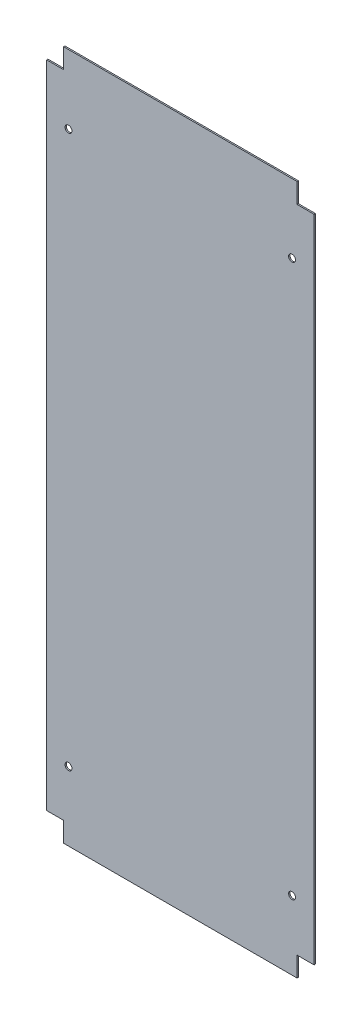
ISO-10303-21;
HEADER;
FILE_DESCRIPTION(('STEP AP214'),'2;1');
FILE_NAME('part.step','',(''),(''),'','','');
FILE_SCHEMA(('AUTOMOTIVE_DESIGN { 1 0 10303 214 1 1 1 1 }'));
ENDSEC;
DATA;
#1=APPLICATION_CONTEXT('core data for automotive mechanical design processes');
#2=APPLICATION_PROTOCOL_DEFINITION('international standard','automotive_design',2000,#1);
#3=PRODUCT_CONTEXT('',#1,'mechanical');
#4=PRODUCT('Part','Part','',(#3));
#5=PRODUCT_RELATED_PRODUCT_CATEGORY('part','',(#4));
#6=PRODUCT_DEFINITION_FORMATION('','',#4);
#7=PRODUCT_DEFINITION_CONTEXT('part definition',#1,'design');
#8=PRODUCT_DEFINITION('design','',#6,#7);
#9=PRODUCT_DEFINITION_SHAPE('','',#8);
#10=(LENGTH_UNIT() NAMED_UNIT(*) SI_UNIT(.MILLI.,.METRE.));
#11=(NAMED_UNIT(*) PLANE_ANGLE_UNIT() SI_UNIT($,.RADIAN.));
#12=(NAMED_UNIT(*) SI_UNIT($,.STERADIAN.) SOLID_ANGLE_UNIT());
#13=UNCERTAINTY_MEASURE_WITH_UNIT(LENGTH_MEASURE(1.E-05),#10,'distance_accuracy_value','');
#14=(GEOMETRIC_REPRESENTATION_CONTEXT(3) GLOBAL_UNCERTAINTY_ASSIGNED_CONTEXT((#13)) GLOBAL_UNIT_ASSIGNED_CONTEXT((#10,
#11,#12)) REPRESENTATION_CONTEXT('',''));
#15=CARTESIAN_POINT('',(0.,0.,0.));
#16=DIRECTION('',(0.,0.,1.));
#17=DIRECTION('',(1.,0.,0.));
#18=AXIS2_PLACEMENT_3D('',#15,#16,#17);
#19=CARTESIAN_POINT('',(137.287,-373.888,-19.05));
#20=DIRECTION('',(0.,1.,0.));
#21=DIRECTION('',(0.,0.,1.));
#22=AXIS2_PLACEMENT_3D('',#19,#20,#21);
#23=PLANE('',#22);
#24=DIRECTION('',(1.,0.,0.));
#25=VECTOR('',#24,1.);
#26=CARTESIAN_POINT('',(0.,-373.888,-1.524));
#27=LINE('',#26,#25);
#28=CARTESIAN_POINT('',(134.1628,-373.888,-1.524));
#29=VERTEX_POINT('',#28);
#30=CARTESIAN_POINT('',(153.783962531012,-373.888,-1.52399999999989));
#31=VERTEX_POINT('',#30);
#32=EDGE_CURVE('E350',#29,#31,#27,.T.);
#33=ORIENTED_EDGE('',*,*,#32,.T.);
#34=DIRECTION('',(0.,0.,-1.));
#35=VECTOR('',#34,1.);
#36=CARTESIAN_POINT('',(153.783962531012,-373.888,1.66533453693773E-13));
#37=LINE('',#36,#35);
#38=CARTESIAN_POINT('',(153.783962531012,-373.888,1.66533453693773E-13));
#39=VERTEX_POINT('',#38);
#40=EDGE_CURVE('E270',#39,#31,#37,.T.);
#41=ORIENTED_EDGE('',*,*,#40,.F.);
#42=DIRECTION('',(-1.,0.,0.));
#43=VECTOR('',#42,1.);
#44=CARTESIAN_POINT('',(137.287,-373.888,0.));
#45=LINE('',#44,#43);
#46=CARTESIAN_POINT('',(134.1628,-373.888,0.));
#47=VERTEX_POINT('',#46);
#48=EDGE_CURVE('E297',#39,#47,#45,.T.);
#49=ORIENTED_EDGE('',*,*,#48,.T.);
#50=DIRECTION('',(0.,0.,1.));
#51=VECTOR('',#50,1.);
#52=CARTESIAN_POINT('',(134.1628,-373.888,-19.05));
#53=LINE('',#52,#51);
#54=EDGE_CURVE('E323',#29,#47,#53,.T.);
#55=ORIENTED_EDGE('',*,*,#54,.F.);
#56=EDGE_LOOP('',(#33,#41,#49,#55));
#57=FACE_BOUND('',#56,.T.);
#58=ADVANCED_FACE('F136',(#57),#23,.F.);
#59=CARTESIAN_POINT('',(134.1628,-380.238,-19.05));
#60=DIRECTION('',(-1.,0.,0.));
#61=DIRECTION('',(0.,0.,1.));
#62=AXIS2_PLACEMENT_3D('',#59,#60,#61);
#63=PLANE('',#62);
#64=DIRECTION('',(0.,-1.,0.));
#65=VECTOR('',#64,1.);
#66=CARTESIAN_POINT('',(134.1628,-380.238,0.));
#67=LINE('',#66,#65);
#68=CARTESIAN_POINT('',(134.1628,-396.734962531012,1.66533453693773E-13));
#69=VERTEX_POINT('',#68);
#70=EDGE_CURVE('E332',#47,#69,#67,.T.);
#71=ORIENTED_EDGE('',*,*,#70,.T.);
#72=DIRECTION('',(0.,0.,1.));
#73=VECTOR('',#72,1.);
#74=CARTESIAN_POINT('',(134.1628,-396.734962531012,1.66533453693773E-13));
#75=LINE('',#74,#73);
#76=CARTESIAN_POINT('',(134.1628,-396.734962531012,-1.52399999999986));
#77=VERTEX_POINT('',#76);
#78=EDGE_CURVE('E258',#77,#69,#75,.T.);
#79=ORIENTED_EDGE('',*,*,#78,.F.);
#80=DIRECTION('',(0.,1.,0.));
#81=VECTOR('',#80,1.);
#82=CARTESIAN_POINT('',(134.1628,0.,-1.524));
#83=LINE('',#82,#81);
#84=EDGE_CURVE('E152',#77,#29,#83,.T.);
#85=ORIENTED_EDGE('',*,*,#84,.T.);
#86=ORIENTED_EDGE('',*,*,#54,.T.);
#87=EDGE_LOOP('',(#71,#79,#85,#86));
#88=FACE_BOUND('',#87,.T.);
#89=ADVANCED_FACE('F415',(#88),#63,.F.);
#90=CARTESIAN_POINT('',(134.1628,380.238,-19.05));
#91=DIRECTION('',(-1.,0.,0.));
#92=DIRECTION('',(0.,-1.,0.));
#93=AXIS2_PLACEMENT_3D('',#90,#91,#92);
#94=PLANE('',#93);
#95=DIRECTION('',(0.,1.,0.));
#96=VECTOR('',#95,1.);
#97=CARTESIAN_POINT('',(134.162799999997,-1.17283960321398E-12,-1.524));
#98=LINE('',#97,#96);
#99=CARTESIAN_POINT('',(134.1628,373.888,-1.524));
#100=VERTEX_POINT('',#99);
#101=CARTESIAN_POINT('',(134.1628,396.734962531012,-1.52399999999986));
#102=VERTEX_POINT('',#101);
#103=EDGE_CURVE('E242',#100,#102,#98,.T.);
#104=ORIENTED_EDGE('',*,*,#103,.T.);
#105=DIRECTION('',(0.,0.,-1.));
#106=VECTOR('',#105,1.);
#107=CARTESIAN_POINT('',(134.1628,396.734962531012,0.));
#108=LINE('',#107,#106);
#109=CARTESIAN_POINT('',(134.1628,396.734962531012,0.));
#110=VERTEX_POINT('',#109);
#111=EDGE_CURVE('E239',#110,#102,#108,.T.);
#112=ORIENTED_EDGE('',*,*,#111,.F.);
#113=DIRECTION('',(0.,-1.,0.));
#114=VECTOR('',#113,1.);
#115=CARTESIAN_POINT('',(134.1628,380.238,0.));
#116=LINE('',#115,#114);
#117=CARTESIAN_POINT('',(134.1628,373.888,0.));
#118=VERTEX_POINT('',#117);
#119=EDGE_CURVE('E227',#110,#118,#116,.T.);
#120=ORIENTED_EDGE('',*,*,#119,.T.);
#121=DIRECTION('',(0.,0.,1.));
#122=VECTOR('',#121,1.);
#123=CARTESIAN_POINT('',(134.1628,373.888,-19.05));
#124=LINE('',#123,#122);
#125=EDGE_CURVE('E339',#100,#118,#124,.T.);
#126=ORIENTED_EDGE('',*,*,#125,.F.);
#127=EDGE_LOOP('',(#104,#112,#120,#126));
#128=FACE_BOUND('',#127,.T.);
#129=ADVANCED_FACE('F240',(#128),#94,.F.);
#130=CARTESIAN_POINT('',(137.287,373.888,-19.05));
#131=DIRECTION('',(0.,-1.,0.));
#132=DIRECTION('',(0.,0.,-1.));
#133=AXIS2_PLACEMENT_3D('',#130,#131,#132);
#134=PLANE('',#133);
#135=DIRECTION('',(1.,0.,0.));
#136=VECTOR('',#135,1.);
#137=CARTESIAN_POINT('',(137.287,373.888,0.));
#138=LINE('',#137,#136);
#139=CARTESIAN_POINT('',(153.783962531012,373.888,1.11022302462516E-13));
#140=VERTEX_POINT('',#139);
#141=EDGE_CURVE('E233',#118,#140,#138,.T.);
#142=ORIENTED_EDGE('',*,*,#141,.T.);
#143=DIRECTION('',(0.,0.,1.));
#144=VECTOR('',#143,1.);
#145=CARTESIAN_POINT('',(153.783962531012,373.888,1.11022302462516E-13));
#146=LINE('',#145,#144);
#147=CARTESIAN_POINT('',(153.783962531012,373.888,-1.52399999999989));
#148=VERTEX_POINT('',#147);
#149=EDGE_CURVE('E282',#148,#140,#146,.T.);
#150=ORIENTED_EDGE('',*,*,#149,.F.);
#151=DIRECTION('',(-1.,0.,0.));
#152=VECTOR('',#151,1.);
#153=CARTESIAN_POINT('',(0.,373.888,-1.524));
#154=LINE('',#153,#152);
#155=EDGE_CURVE('E160',#148,#100,#154,.T.);
#156=ORIENTED_EDGE('',*,*,#155,.T.);
#157=ORIENTED_EDGE('',*,*,#125,.T.);
#158=EDGE_LOOP('',(#142,#150,#156,#157));
#159=FACE_BOUND('',#158,.T.);
#160=ADVANCED_FACE('F423',(#159),#134,.F.);
#161=CARTESIAN_POINT('',(-134.1628,-380.238,-19.05));
#162=DIRECTION('',(1.,0.,0.));
#163=DIRECTION('',(0.,1.,0.));
#164=AXIS2_PLACEMENT_3D('',#161,#162,#163);
#165=PLANE('',#164);
#166=DIRECTION('',(0.,-1.,0.));
#167=VECTOR('',#166,1.);
#168=CARTESIAN_POINT('',(-134.162800000003,-1.17283960321406E-12,-1.524));
#169=LINE('',#168,#167);
#170=CARTESIAN_POINT('',(-134.1628,-373.888,-1.524));
#171=VERTEX_POINT('',#170);
#172=CARTESIAN_POINT('',(-134.1628,-396.734962531012,-1.52399999999986));
#173=VERTEX_POINT('',#172);
#174=EDGE_CURVE('E353',#171,#173,#169,.T.);
#175=ORIENTED_EDGE('',*,*,#174,.T.);
#176=DIRECTION('',(0.,0.,-1.));
#177=VECTOR('',#176,1.);
#178=CARTESIAN_POINT('',(-134.1628,-396.734962531012,1.11022302462516E-13));
#179=LINE('',#178,#177);
#180=CARTESIAN_POINT('',(-134.1628,-396.734962531012,1.11022302462516E-13));
#181=VERTEX_POINT('',#180);
#182=EDGE_CURVE('E271',#181,#173,#179,.T.);
#183=ORIENTED_EDGE('',*,*,#182,.F.);
#184=DIRECTION('',(0.,1.,0.));
#185=VECTOR('',#184,1.);
#186=CARTESIAN_POINT('',(-134.1628,-380.238,0.));
#187=LINE('',#186,#185);
#188=CARTESIAN_POINT('',(-134.1628,-373.888,0.));
#189=VERTEX_POINT('',#188);
#190=EDGE_CURVE('E319',#181,#189,#187,.T.);
#191=ORIENTED_EDGE('',*,*,#190,.T.);
#192=DIRECTION('',(0.,0.,1.));
#193=VECTOR('',#192,1.);
#194=CARTESIAN_POINT('',(-134.1628,-373.888,-19.05));
#195=LINE('',#194,#193);
#196=EDGE_CURVE('E314',#171,#189,#195,.T.);
#197=ORIENTED_EDGE('',*,*,#196,.F.);
#198=EDGE_LOOP('',(#175,#183,#191,#197));
#199=FACE_BOUND('',#198,.T.);
#200=ADVANCED_FACE('F426',(#199),#165,.F.);
#201=CARTESIAN_POINT('',(-137.287,-373.888,-19.05));
#202=DIRECTION('',(0.,1.,0.));
#203=DIRECTION('',(0.,0.,1.));
#204=AXIS2_PLACEMENT_3D('',#201,#202,#203);
#205=PLANE('',#204);
#206=DIRECTION('',(-1.,0.,0.));
#207=VECTOR('',#206,1.);
#208=CARTESIAN_POINT('',(-137.287,-373.888,0.));
#209=LINE('',#208,#207);
#210=CARTESIAN_POINT('',(-153.783962531012,-373.888,0.));
#211=VERTEX_POINT('',#210);
#212=EDGE_CURVE('E322',#189,#211,#209,.T.);
#213=ORIENTED_EDGE('',*,*,#212,.T.);
#214=DIRECTION('',(0.,0.,1.));
#215=VECTOR('',#214,1.);
#216=CARTESIAN_POINT('',(-153.783962531012,-373.888,0.));
#217=LINE('',#216,#215);
#218=CARTESIAN_POINT('',(-153.783962531012,-373.888,-1.52399999999997));
#219=VERTEX_POINT('',#218);
#220=EDGE_CURVE('E302',#219,#211,#217,.T.);
#221=ORIENTED_EDGE('',*,*,#220,.F.);
#222=DIRECTION('',(1.,0.,0.));
#223=VECTOR('',#222,1.);
#224=CARTESIAN_POINT('',(0.,-373.888,-1.524));
#225=LINE('',#224,#223);
#226=EDGE_CURVE('E345',#219,#171,#225,.T.);
#227=ORIENTED_EDGE('',*,*,#226,.T.);
#228=ORIENTED_EDGE('',*,*,#196,.T.);
#229=EDGE_LOOP('',(#213,#221,#227,#228));
#230=FACE_BOUND('',#229,.T.);
#231=ADVANCED_FACE('F429',(#230),#205,.F.);
#232=CARTESIAN_POINT('',(-137.287,373.888,-19.05));
#233=DIRECTION('',(0.,-1.,0.));
#234=DIRECTION('',(0.,0.,-1.));
#235=AXIS2_PLACEMENT_3D('',#232,#233,#234);
#236=PLANE('',#235);
#237=DIRECTION('',(-1.,0.,0.));
#238=VECTOR('',#237,1.);
#239=CARTESIAN_POINT('',(0.,373.888,-1.524));
#240=LINE('',#239,#238);
#241=CARTESIAN_POINT('',(-134.1628,373.888,-1.524));
#242=VERTEX_POINT('',#241);
#243=CARTESIAN_POINT('',(-153.783962531012,373.888,-1.52399999999986));
#244=VERTEX_POINT('',#243);
#245=EDGE_CURVE('E342',#242,#244,#240,.T.);
#246=ORIENTED_EDGE('',*,*,#245,.T.);
#247=DIRECTION('',(0.,0.,-1.));
#248=VECTOR('',#247,1.);
#249=CARTESIAN_POINT('',(-153.783962531012,373.888,0.));
#250=LINE('',#249,#248);
#251=CARTESIAN_POINT('',(-153.783962531012,373.888,0.));
#252=VERTEX_POINT('',#251);
#253=EDGE_CURVE('E298',#252,#244,#250,.T.);
#254=ORIENTED_EDGE('',*,*,#253,.F.);
#255=DIRECTION('',(1.,0.,0.));
#256=VECTOR('',#255,1.);
#257=CARTESIAN_POINT('',(-137.287,373.888,0.));
#258=LINE('',#257,#256);
#259=CARTESIAN_POINT('',(-134.1628,373.888,0.));
#260=VERTEX_POINT('',#259);
#261=EDGE_CURVE('E309',#252,#260,#258,.T.);
#262=ORIENTED_EDGE('',*,*,#261,.T.);
#263=DIRECTION('',(0.,0.,1.));
#264=VECTOR('',#263,1.);
#265=CARTESIAN_POINT('',(-134.1628,373.888,-19.05));
#266=LINE('',#265,#264);
#267=EDGE_CURVE('E236',#242,#260,#266,.T.);
#268=ORIENTED_EDGE('',*,*,#267,.F.);
#269=EDGE_LOOP('',(#246,#254,#262,#268));
#270=FACE_BOUND('',#269,.T.);
#271=ADVANCED_FACE('F433',(#270),#236,.F.);
#272=CARTESIAN_POINT('',(-134.1628,380.238,-19.05));
#273=DIRECTION('',(1.,0.,0.));
#274=DIRECTION('',(0.,1.,0.));
#275=AXIS2_PLACEMENT_3D('',#272,#273,#274);
#276=PLANE('',#275);
#277=DIRECTION('',(0.,1.,0.));
#278=VECTOR('',#277,1.);
#279=CARTESIAN_POINT('',(-134.1628,380.238,0.));
#280=LINE('',#279,#278);
#281=CARTESIAN_POINT('',(-134.1628,396.734962531012,0.));
#282=VERTEX_POINT('',#281);
#283=EDGE_CURVE('E313',#260,#282,#280,.T.);
#284=ORIENTED_EDGE('',*,*,#283,.T.);
#285=DIRECTION('',(0.,0.,1.));
#286=VECTOR('',#285,1.);
#287=CARTESIAN_POINT('',(-134.1628,396.734962531012,0.));
#288=LINE('',#287,#286);
#289=CARTESIAN_POINT('',(-134.1628,396.734962531012,-1.52399999999986));
#290=VERTEX_POINT('',#289);
#291=EDGE_CURVE('E247',#290,#282,#288,.T.);
#292=ORIENTED_EDGE('',*,*,#291,.F.);
#293=DIRECTION('',(0.,-1.,0.));
#294=VECTOR('',#293,1.);
#295=CARTESIAN_POINT('',(-134.162799999997,-1.17283960321396E-12,-1.524));
#296=LINE('',#295,#294);
#297=EDGE_CURVE('E360',#290,#242,#296,.T.);
#298=ORIENTED_EDGE('',*,*,#297,.T.);
#299=ORIENTED_EDGE('',*,*,#267,.T.);
#300=EDGE_LOOP('',(#284,#292,#298,#299));
#301=FACE_BOUND('',#300,.T.);
#302=ADVANCED_FACE('F431',(#301),#276,.F.);
#303=CARTESIAN_POINT('',(0.,0.,-1.524));
#304=DIRECTION('',(0.,0.,-1.));
#305=DIRECTION('',(-1.,0.,0.));
#306=AXIS2_PLACEMENT_3D('',#303,#304,#305);
#307=PLANE('',#306);
#308=ORIENTED_EDGE('',*,*,#84,.F.);
#309=DIRECTION('',(-1.,0.,0.));
#310=VECTOR('',#309,1.);
#311=CARTESIAN_POINT('',(137.287,-396.734962531012,-1.52399999999986));
#312=LINE('',#311,#310);
#313=EDGE_CURVE('E253',#173,#77,#312,.F.);
#314=ORIENTED_EDGE('',*,*,#313,.F.);
#315=ORIENTED_EDGE('',*,*,#174,.F.);
#316=ORIENTED_EDGE('',*,*,#226,.F.);
#317=DIRECTION('',(0.,1.,0.));
#318=VECTOR('',#317,1.);
#319=CARTESIAN_POINT('',(-153.783962531012,-380.238,-1.52399999999997));
#320=LINE('',#319,#318);
#321=EDGE_CURVE('E281',#244,#219,#320,.F.);
#322=ORIENTED_EDGE('',*,*,#321,.F.);
#323=ORIENTED_EDGE('',*,*,#245,.F.);
#324=ORIENTED_EDGE('',*,*,#297,.F.);
#325=DIRECTION('',(1.,0.,0.));
#326=VECTOR('',#325,1.);
#327=CARTESIAN_POINT('',(-137.287,396.734962531012,-1.52399999999986));
#328=LINE('',#327,#326);
#329=EDGE_CURVE('E263',#102,#290,#328,.F.);
#330=ORIENTED_EDGE('',*,*,#329,.F.);
#331=ORIENTED_EDGE('',*,*,#103,.F.);
#332=ORIENTED_EDGE('',*,*,#155,.F.);
#333=DIRECTION('',(0.,-1.,0.));
#334=VECTOR('',#333,1.);
#335=CARTESIAN_POINT('',(153.783962531012,380.238,-1.52399999999989));
#336=LINE('',#335,#334);
#337=EDGE_CURVE('E286',#31,#148,#336,.F.);
#338=ORIENTED_EDGE('',*,*,#337,.F.);
#339=ORIENTED_EDGE('',*,*,#32,.F.);
#340=EDGE_LOOP('',(#308,#314,#315,#316,#322,#323,#324,#330,#331,#332,#338,#339));
#341=FACE_BOUND('',#340,.T.);
#342=CARTESIAN_POINT('',(128.524,317.5,-1.524));
#343=DIRECTION('',(0.,0.,1.));
#344=DIRECTION('',(1.,0.,0.));
#345=AXIS2_PLACEMENT_3D('',#342,#343,#344);
#346=CIRCLE('',#345,3.9624);
#347=CARTESIAN_POINT('',(132.4864,317.5,-1.524));
#348=VERTEX_POINT('',#347);
#349=EDGE_CURVE('E364',#348,#348,#346,.T.);
#350=ORIENTED_EDGE('',*,*,#349,.T.);
#351=EDGE_LOOP('',(#350));
#352=FACE_BOUND('',#351,.T.);
#353=CARTESIAN_POINT('',(128.524,-317.5,-1.524));
#354=DIRECTION('',(0.,0.,1.));
#355=DIRECTION('',(1.,0.,0.));
#356=AXIS2_PLACEMENT_3D('',#353,#354,#355);
#357=CIRCLE('',#356,3.9624);
#358=CARTESIAN_POINT('',(132.4864,-317.5,-1.524));
#359=VERTEX_POINT('',#358);
#360=EDGE_CURVE('E372',#359,#359,#357,.T.);
#361=ORIENTED_EDGE('',*,*,#360,.T.);
#362=EDGE_LOOP('',(#361));
#363=FACE_BOUND('',#362,.T.);
#364=CARTESIAN_POINT('',(-128.651,-317.5,-1.524));
#365=DIRECTION('',(0.,0.,1.));
#366=DIRECTION('',(1.,0.,0.));
#367=AXIS2_PLACEMENT_3D('',#364,#365,#366);
#368=CIRCLE('',#367,3.9624);
#369=CARTESIAN_POINT('',(-124.6886,-317.5,-1.524));
#370=VERTEX_POINT('',#369);
#371=EDGE_CURVE('E380',#370,#370,#368,.T.);
#372=ORIENTED_EDGE('',*,*,#371,.T.);
#373=EDGE_LOOP('',(#372));
#374=FACE_BOUND('',#373,.T.);
#375=CARTESIAN_POINT('',(-128.651,317.5,-1.524));
#376=DIRECTION('',(0.,0.,1.));
#377=DIRECTION('',(1.,0.,0.));
#378=AXIS2_PLACEMENT_3D('',#375,#376,#377);
#379=CIRCLE('',#378,3.9624);
#380=CARTESIAN_POINT('',(-124.6886,317.5,-1.524));
#381=VERTEX_POINT('',#380);
#382=EDGE_CURVE('E13',#381,#381,#379,.T.);
#383=ORIENTED_EDGE('',*,*,#382,.T.);
#384=EDGE_LOOP('',(#383));
#385=FACE_BOUND('',#384,.T.);
#386=ADVANCED_FACE('F394',(#341,#352,#363,#374,#385),#307,.T.);
#387=CARTESIAN_POINT('',(0.,0.,0.));
#388=DIRECTION('',(0.,0.,-1.));
#389=DIRECTION('',(-1.,0.,0.));
#390=AXIS2_PLACEMENT_3D('',#387,#388,#389);
#391=PLANE('',#390);
#392=CARTESIAN_POINT('',(128.524,317.5,0.));
#393=DIRECTION('',(0.,0.,1.));
#394=DIRECTION('',(1.,0.,0.));
#395=AXIS2_PLACEMENT_3D('',#392,#393,#394);
#396=CIRCLE('',#395,3.9624);
#397=CARTESIAN_POINT('',(132.4864,317.5,0.));
#398=VERTEX_POINT('',#397);
#399=EDGE_CURVE('E363',#398,#398,#396,.T.);
#400=ORIENTED_EDGE('',*,*,#399,.F.);
#401=EDGE_LOOP('',(#400));
#402=FACE_BOUND('',#401,.T.);
#403=CARTESIAN_POINT('',(128.524,-317.5,0.));
#404=DIRECTION('',(0.,0.,1.));
#405=DIRECTION('',(1.,0.,0.));
#406=AXIS2_PLACEMENT_3D('',#403,#404,#405);
#407=CIRCLE('',#406,3.9624);
#408=CARTESIAN_POINT('',(132.4864,-317.5,0.));
#409=VERTEX_POINT('',#408);
#410=EDGE_CURVE('E368',#409,#409,#407,.T.);
#411=ORIENTED_EDGE('',*,*,#410,.F.);
#412=EDGE_LOOP('',(#411));
#413=FACE_BOUND('',#412,.T.);
#414=CARTESIAN_POINT('',(-128.651,-317.5,0.));
#415=DIRECTION('',(0.,0.,1.));
#416=DIRECTION('',(1.,0.,0.));
#417=AXIS2_PLACEMENT_3D('',#414,#415,#416);
#418=CIRCLE('',#417,3.9624);
#419=CARTESIAN_POINT('',(-124.6886,-317.5,0.));
#420=VERTEX_POINT('',#419);
#421=EDGE_CURVE('E376',#420,#420,#418,.T.);
#422=ORIENTED_EDGE('',*,*,#421,.F.);
#423=EDGE_LOOP('',(#422));
#424=FACE_BOUND('',#423,.T.);
#425=CARTESIAN_POINT('',(-128.651,317.5,0.));
#426=DIRECTION('',(0.,0.,1.));
#427=DIRECTION('',(1.,0.,0.));
#428=AXIS2_PLACEMENT_3D('',#425,#426,#427);
#429=CIRCLE('',#428,3.9624);
#430=CARTESIAN_POINT('',(-124.6886,317.5,0.));
#431=VERTEX_POINT('',#430);
#432=EDGE_CURVE('E140',#431,#431,#429,.T.);
#433=ORIENTED_EDGE('',*,*,#432,.F.);
#434=EDGE_LOOP('',(#433));
#435=FACE_BOUND('',#434,.T.);
#436=ORIENTED_EDGE('',*,*,#190,.F.);
#437=DIRECTION('',(1.,0.,0.));
#438=VECTOR('',#437,1.);
#439=CARTESIAN_POINT('',(0.,-396.734962531012,1.66533453693773E-13));
#440=LINE('',#439,#438);
#441=EDGE_CURVE('E266',#181,#69,#440,.T.);
#442=ORIENTED_EDGE('',*,*,#441,.T.);
#443=ORIENTED_EDGE('',*,*,#70,.F.);
#444=ORIENTED_EDGE('',*,*,#48,.F.);
#445=DIRECTION('',(0.,1.,0.));
#446=VECTOR('',#445,1.);
#447=CARTESIAN_POINT('',(153.783962531012,0.,1.11022302462516E-13));
#448=LINE('',#447,#446);
#449=EDGE_CURVE('E278',#39,#140,#448,.T.);
#450=ORIENTED_EDGE('',*,*,#449,.T.);
#451=ORIENTED_EDGE('',*,*,#141,.F.);
#452=ORIENTED_EDGE('',*,*,#119,.F.);
#453=DIRECTION('',(-1.,0.,0.));
#454=VECTOR('',#453,1.);
#455=CARTESIAN_POINT('',(0.,396.734962531012,1.66533453693773E-13));
#456=LINE('',#455,#454);
#457=EDGE_CURVE('E231',#110,#282,#456,.T.);
#458=ORIENTED_EDGE('',*,*,#457,.T.);
#459=ORIENTED_EDGE('',*,*,#283,.F.);
#460=ORIENTED_EDGE('',*,*,#261,.F.);
#461=DIRECTION('',(0.,-1.,0.));
#462=VECTOR('',#461,1.);
#463=CARTESIAN_POINT('',(-153.783962531012,0.,0.));
#464=LINE('',#463,#462);
#465=EDGE_CURVE('E293',#252,#211,#464,.T.);
#466=ORIENTED_EDGE('',*,*,#465,.T.);
#467=ORIENTED_EDGE('',*,*,#212,.F.);
#468=EDGE_LOOP('',(#436,#442,#443,#444,#450,#451,#452,#458,#459,#460,#466,#467));
#469=FACE_BOUND('',#468,.T.);
#470=ADVANCED_FACE('F138',(#402,#413,#424,#435,#469),#391,.F.);
#471=CARTESIAN_POINT('',(-128.651,317.5,-1.524));
#472=DIRECTION('',(0.,0.,1.));
#473=DIRECTION('',(1.,0.,0.));
#474=AXIS2_PLACEMENT_3D('',#471,#472,#473);
#475=CYLINDRICAL_SURFACE('',#474,3.9624);
#476=CARTESIAN_POINT('',(-124.6886,317.5,-1.524));
#477=CARTESIAN_POINT('',(-124.6886,317.5,-1.508125));
#478=CARTESIAN_POINT('',(-124.6886,317.5,-1.49225));
#479=CARTESIAN_POINT('',(-124.6886,317.5,-1.4605));
#480=CARTESIAN_POINT('',(-124.6886,317.5,-1.444625));
#481=CARTESIAN_POINT('',(-124.6886,317.5,-1.412875));
#482=CARTESIAN_POINT('',(-124.6886,317.5,-1.397));
#483=CARTESIAN_POINT('',(-124.6886,317.5,-1.36525));
#484=CARTESIAN_POINT('',(-124.6886,317.5,-1.349375));
#485=CARTESIAN_POINT('',(-124.6886,317.5,-1.317625));
#486=CARTESIAN_POINT('',(-124.6886,317.5,-1.30175));
#487=CARTESIAN_POINT('',(-124.6886,317.5,-1.27));
#488=CARTESIAN_POINT('',(-124.6886,317.5,-1.254125));
#489=CARTESIAN_POINT('',(-124.6886,317.5,-1.222375));
#490=CARTESIAN_POINT('',(-124.6886,317.5,-1.2065));
#491=CARTESIAN_POINT('',(-124.6886,317.5,-1.17475));
#492=CARTESIAN_POINT('',(-124.6886,317.5,-1.158875));
#493=CARTESIAN_POINT('',(-124.6886,317.5,-1.127125));
#494=CARTESIAN_POINT('',(-124.6886,317.5,-1.11125));
#495=CARTESIAN_POINT('',(-124.6886,317.5,-1.0795));
#496=CARTESIAN_POINT('',(-124.6886,317.5,-1.063625));
#497=CARTESIAN_POINT('',(-124.6886,317.5,-1.031875));
#498=CARTESIAN_POINT('',(-124.6886,317.5,-1.016));
#499=CARTESIAN_POINT('',(-124.6886,317.5,-0.98425));
#500=CARTESIAN_POINT('',(-124.6886,317.5,-0.968375));
#501=CARTESIAN_POINT('',(-124.6886,317.5,-0.936625));
#502=CARTESIAN_POINT('',(-124.6886,317.5,-0.92075));
#503=CARTESIAN_POINT('',(-124.6886,317.5,-0.889));
#504=CARTESIAN_POINT('',(-124.6886,317.5,-0.873125));
#505=CARTESIAN_POINT('',(-124.6886,317.5,-0.841375));
#506=CARTESIAN_POINT('',(-124.6886,317.5,-0.8255));
#507=CARTESIAN_POINT('',(-124.6886,317.5,-0.79375));
#508=CARTESIAN_POINT('',(-124.6886,317.5,-0.777875));
#509=CARTESIAN_POINT('',(-124.6886,317.5,-0.746125));
#510=CARTESIAN_POINT('',(-124.6886,317.5,-0.73025));
#511=CARTESIAN_POINT('',(-124.6886,317.5,-0.6985));
#512=CARTESIAN_POINT('',(-124.6886,317.5,-0.682625));
#513=CARTESIAN_POINT('',(-124.6886,317.5,-0.650875));
#514=CARTESIAN_POINT('',(-124.6886,317.5,-0.635));
#515=CARTESIAN_POINT('',(-124.6886,317.5,-0.60325));
#516=CARTESIAN_POINT('',(-124.6886,317.5,-0.587375));
#517=CARTESIAN_POINT('',(-124.6886,317.5,-0.555625));
#518=CARTESIAN_POINT('',(-124.6886,317.5,-0.53975));
#519=CARTESIAN_POINT('',(-124.6886,317.5,-0.508));
#520=CARTESIAN_POINT('',(-124.6886,317.5,-0.492125));
#521=CARTESIAN_POINT('',(-124.6886,317.5,-0.460375));
#522=CARTESIAN_POINT('',(-124.6886,317.5,-0.4445));
#523=CARTESIAN_POINT('',(-124.6886,317.5,-0.41275));
#524=CARTESIAN_POINT('',(-124.6886,317.5,-0.396875));
#525=CARTESIAN_POINT('',(-124.6886,317.5,-0.365125));
#526=CARTESIAN_POINT('',(-124.6886,317.5,-0.34925));
#527=CARTESIAN_POINT('',(-124.6886,317.5,-0.3175));
#528=CARTESIAN_POINT('',(-124.6886,317.5,-0.301625));
#529=CARTESIAN_POINT('',(-124.6886,317.5,-0.269875));
#530=CARTESIAN_POINT('',(-124.6886,317.5,-0.254));
#531=CARTESIAN_POINT('',(-124.6886,317.5,-0.22225));
#532=CARTESIAN_POINT('',(-124.6886,317.5,-0.206375));
#533=CARTESIAN_POINT('',(-124.6886,317.5,-0.174625));
#534=CARTESIAN_POINT('',(-124.6886,317.5,-0.15875));
#535=CARTESIAN_POINT('',(-124.6886,317.5,-0.127));
#536=CARTESIAN_POINT('',(-124.6886,317.5,-0.111125));
#537=CARTESIAN_POINT('',(-124.6886,317.5,-0.079375));
#538=CARTESIAN_POINT('',(-124.6886,317.5,-0.0635));
#539=CARTESIAN_POINT('',(-124.6886,317.5,-0.0317499999999999));
#540=CARTESIAN_POINT('',(-124.6886,317.5,-0.015875));
#541=CARTESIAN_POINT('',(-124.6886,317.5,0.));
#542=B_SPLINE_CURVE_WITH_KNOTS('',3,(#476,#477,#478,#479,#480,#481,#482,#483,#484,#485,#486,
#487,#488,#489,#490,#491,#492,#493,#494,#495,#496,#497,#498,#499,#500,#501,#502,#503,#504,#505,
#506,#507,#508,#509,#510,#511,#512,#513,#514,#515,#516,#517,#518,#519,#520,#521,#522,#523,#524,
#525,#526,#527,#528,#529,#530,#531,#532,#533,#534,#535,#536,#537,#538,#539,#540,#541),
.UNSPECIFIED.,.F.,.F.,(4,2,2,2,2,2,2,2,2,2,2,2,2,2,2,2,2,2,2,2,2,2,2,2,2,2,2,2,2,2,2,2,4),(0.,
0.0476249999999999,0.0952499999999998,0.142875,0.1905,0.238125,0.28575,0.333375,0.381,0.428625,
0.47625,0.523875,0.5715,0.619125,0.66675,0.714375,0.762,0.809625,0.85725,0.904875,0.9525,
1.000125,1.04775,1.095375,1.143,1.190625,1.23825,1.285875,1.3335,1.381125,1.42875,1.476375,
1.524),.UNSPECIFIED.);
#543=EDGE_CURVE('BSEAM393',#381,#431,#542,.T.);
#544=ORIENTED_EDGE('',*,*,#382,.F.);
#545=ORIENTED_EDGE('',*,*,#432,.T.);
#546=ORIENTED_EDGE('',*,*,#543,.T.);
#547=ORIENTED_EDGE('',*,*,#543,.F.);
#548=EDGE_LOOP('',(#544,#546,#545,#547));
#549=FACE_BOUND('',#548,.T.);
#550=ADVANCED_FACE('F393',(#549),#475,.F.);
#551=CARTESIAN_POINT('',(-128.651,-317.5,-1.524));
#552=DIRECTION('',(0.,0.,1.));
#553=DIRECTION('',(1.,0.,0.));
#554=AXIS2_PLACEMENT_3D('',#551,#552,#553);
#555=CYLINDRICAL_SURFACE('',#554,3.9624);
#556=CARTESIAN_POINT('',(-124.6886,-317.5,-1.524));
#557=CARTESIAN_POINT('',(-124.6886,-317.5,-1.508125));
#558=CARTESIAN_POINT('',(-124.6886,-317.5,-1.49225));
#559=CARTESIAN_POINT('',(-124.6886,-317.5,-1.4605));
#560=CARTESIAN_POINT('',(-124.6886,-317.5,-1.444625));
#561=CARTESIAN_POINT('',(-124.6886,-317.5,-1.412875));
#562=CARTESIAN_POINT('',(-124.6886,-317.5,-1.397));
#563=CARTESIAN_POINT('',(-124.6886,-317.5,-1.36525));
#564=CARTESIAN_POINT('',(-124.6886,-317.5,-1.349375));
#565=CARTESIAN_POINT('',(-124.6886,-317.5,-1.317625));
#566=CARTESIAN_POINT('',(-124.6886,-317.5,-1.30175));
#567=CARTESIAN_POINT('',(-124.6886,-317.5,-1.27));
#568=CARTESIAN_POINT('',(-124.6886,-317.5,-1.254125));
#569=CARTESIAN_POINT('',(-124.6886,-317.5,-1.222375));
#570=CARTESIAN_POINT('',(-124.6886,-317.5,-1.2065));
#571=CARTESIAN_POINT('',(-124.6886,-317.5,-1.17475));
#572=CARTESIAN_POINT('',(-124.6886,-317.5,-1.158875));
#573=CARTESIAN_POINT('',(-124.6886,-317.5,-1.127125));
#574=CARTESIAN_POINT('',(-124.6886,-317.5,-1.11125));
#575=CARTESIAN_POINT('',(-124.6886,-317.5,-1.0795));
#576=CARTESIAN_POINT('',(-124.6886,-317.5,-1.063625));
#577=CARTESIAN_POINT('',(-124.6886,-317.5,-1.031875));
#578=CARTESIAN_POINT('',(-124.6886,-317.5,-1.016));
#579=CARTESIAN_POINT('',(-124.6886,-317.5,-0.98425));
#580=CARTESIAN_POINT('',(-124.6886,-317.5,-0.968375));
#581=CARTESIAN_POINT('',(-124.6886,-317.5,-0.936625));
#582=CARTESIAN_POINT('',(-124.6886,-317.5,-0.92075));
#583=CARTESIAN_POINT('',(-124.6886,-317.5,-0.889));
#584=CARTESIAN_POINT('',(-124.6886,-317.5,-0.873125));
#585=CARTESIAN_POINT('',(-124.6886,-317.5,-0.841375));
#586=CARTESIAN_POINT('',(-124.6886,-317.5,-0.8255));
#587=CARTESIAN_POINT('',(-124.6886,-317.5,-0.79375));
#588=CARTESIAN_POINT('',(-124.6886,-317.5,-0.777875));
#589=CARTESIAN_POINT('',(-124.6886,-317.5,-0.746125));
#590=CARTESIAN_POINT('',(-124.6886,-317.5,-0.73025));
#591=CARTESIAN_POINT('',(-124.6886,-317.5,-0.6985));
#592=CARTESIAN_POINT('',(-124.6886,-317.5,-0.682625));
#593=CARTESIAN_POINT('',(-124.6886,-317.5,-0.650875));
#594=CARTESIAN_POINT('',(-124.6886,-317.5,-0.635));
#595=CARTESIAN_POINT('',(-124.6886,-317.5,-0.60325));
#596=CARTESIAN_POINT('',(-124.6886,-317.5,-0.587375));
#597=CARTESIAN_POINT('',(-124.6886,-317.5,-0.555625));
#598=CARTESIAN_POINT('',(-124.6886,-317.5,-0.53975));
#599=CARTESIAN_POINT('',(-124.6886,-317.5,-0.508));
#600=CARTESIAN_POINT('',(-124.6886,-317.5,-0.492125));
#601=CARTESIAN_POINT('',(-124.6886,-317.5,-0.460375));
#602=CARTESIAN_POINT('',(-124.6886,-317.5,-0.4445));
#603=CARTESIAN_POINT('',(-124.6886,-317.5,-0.41275));
#604=CARTESIAN_POINT('',(-124.6886,-317.5,-0.396875));
#605=CARTESIAN_POINT('',(-124.6886,-317.5,-0.365125));
#606=CARTESIAN_POINT('',(-124.6886,-317.5,-0.34925));
#607=CARTESIAN_POINT('',(-124.6886,-317.5,-0.3175));
#608=CARTESIAN_POINT('',(-124.6886,-317.5,-0.301625));
#609=CARTESIAN_POINT('',(-124.6886,-317.5,-0.269875));
#610=CARTESIAN_POINT('',(-124.6886,-317.5,-0.254));
#611=CARTESIAN_POINT('',(-124.6886,-317.5,-0.22225));
#612=CARTESIAN_POINT('',(-124.6886,-317.5,-0.206375));
#613=CARTESIAN_POINT('',(-124.6886,-317.5,-0.174625));
#614=CARTESIAN_POINT('',(-124.6886,-317.5,-0.15875));
#615=CARTESIAN_POINT('',(-124.6886,-317.5,-0.127));
#616=CARTESIAN_POINT('',(-124.6886,-317.5,-0.111125));
#617=CARTESIAN_POINT('',(-124.6886,-317.5,-0.079375));
#618=CARTESIAN_POINT('',(-124.6886,-317.5,-0.0635));
#619=CARTESIAN_POINT('',(-124.6886,-317.5,-0.0317499999999999));
#620=CARTESIAN_POINT('',(-124.6886,-317.5,-0.015875));
#621=CARTESIAN_POINT('',(-124.6886,-317.5,0.));
#622=B_SPLINE_CURVE_WITH_KNOTS('',3,(#556,#557,#558,#559,#560,#561,#562,#563,#564,#565,#566,
#567,#568,#569,#570,#571,#572,#573,#574,#575,#576,#577,#578,#579,#580,#581,#582,#583,#584,#585,
#586,#587,#588,#589,#590,#591,#592,#593,#594,#595,#596,#597,#598,#599,#600,#601,#602,#603,#604,
#605,#606,#607,#608,#609,#610,#611,#612,#613,#614,#615,#616,#617,#618,#619,#620,#621),
.UNSPECIFIED.,.F.,.F.,(4,2,2,2,2,2,2,2,2,2,2,2,2,2,2,2,2,2,2,2,2,2,2,2,2,2,2,2,2,2,2,2,4),(0.,
0.0476249999999999,0.0952499999999998,0.142875,0.1905,0.238125,0.28575,0.333375,0.381,0.428625,
0.47625,0.523875,0.5715,0.619125,0.66675,0.714375,0.762,0.809625,0.85725,0.904875,0.9525,
1.000125,1.04775,1.095375,1.143,1.190625,1.23825,1.285875,1.3335,1.381125,1.42875,1.476375,
1.524),.UNSPECIFIED.);
#623=EDGE_CURVE('BSEAM389',#370,#420,#622,.T.);
#624=ORIENTED_EDGE('',*,*,#371,.F.);
#625=ORIENTED_EDGE('',*,*,#421,.T.);
#626=ORIENTED_EDGE('',*,*,#623,.T.);
#627=ORIENTED_EDGE('',*,*,#623,.F.);
#628=EDGE_LOOP('',(#624,#626,#625,#627));
#629=FACE_BOUND('',#628,.T.);
#630=ADVANCED_FACE('F389',(#629),#555,.F.);
#631=CARTESIAN_POINT('',(128.524,-317.5,-1.524));
#632=DIRECTION('',(0.,0.,1.));
#633=DIRECTION('',(1.,0.,0.));
#634=AXIS2_PLACEMENT_3D('',#631,#632,#633);
#635=CYLINDRICAL_SURFACE('',#634,3.9624);
#636=CARTESIAN_POINT('',(132.4864,-317.5,-1.524));
#637=CARTESIAN_POINT('',(132.4864,-317.5,-1.508125));
#638=CARTESIAN_POINT('',(132.4864,-317.5,-1.49225));
#639=CARTESIAN_POINT('',(132.4864,-317.5,-1.4605));
#640=CARTESIAN_POINT('',(132.4864,-317.5,-1.444625));
#641=CARTESIAN_POINT('',(132.4864,-317.5,-1.412875));
#642=CARTESIAN_POINT('',(132.4864,-317.5,-1.397));
#643=CARTESIAN_POINT('',(132.4864,-317.5,-1.36525));
#644=CARTESIAN_POINT('',(132.4864,-317.5,-1.349375));
#645=CARTESIAN_POINT('',(132.4864,-317.5,-1.317625));
#646=CARTESIAN_POINT('',(132.4864,-317.5,-1.30175));
#647=CARTESIAN_POINT('',(132.4864,-317.5,-1.27));
#648=CARTESIAN_POINT('',(132.4864,-317.5,-1.254125));
#649=CARTESIAN_POINT('',(132.4864,-317.5,-1.222375));
#650=CARTESIAN_POINT('',(132.4864,-317.5,-1.2065));
#651=CARTESIAN_POINT('',(132.4864,-317.5,-1.17475));
#652=CARTESIAN_POINT('',(132.4864,-317.5,-1.158875));
#653=CARTESIAN_POINT('',(132.4864,-317.5,-1.127125));
#654=CARTESIAN_POINT('',(132.4864,-317.5,-1.11125));
#655=CARTESIAN_POINT('',(132.4864,-317.5,-1.0795));
#656=CARTESIAN_POINT('',(132.4864,-317.5,-1.063625));
#657=CARTESIAN_POINT('',(132.4864,-317.5,-1.031875));
#658=CARTESIAN_POINT('',(132.4864,-317.5,-1.016));
#659=CARTESIAN_POINT('',(132.4864,-317.5,-0.98425));
#660=CARTESIAN_POINT('',(132.4864,-317.5,-0.968375));
#661=CARTESIAN_POINT('',(132.4864,-317.5,-0.936625));
#662=CARTESIAN_POINT('',(132.4864,-317.5,-0.92075));
#663=CARTESIAN_POINT('',(132.4864,-317.5,-0.889));
#664=CARTESIAN_POINT('',(132.4864,-317.5,-0.873125));
#665=CARTESIAN_POINT('',(132.4864,-317.5,-0.841375));
#666=CARTESIAN_POINT('',(132.4864,-317.5,-0.8255));
#667=CARTESIAN_POINT('',(132.4864,-317.5,-0.79375));
#668=CARTESIAN_POINT('',(132.4864,-317.5,-0.777875));
#669=CARTESIAN_POINT('',(132.4864,-317.5,-0.746125));
#670=CARTESIAN_POINT('',(132.4864,-317.5,-0.73025));
#671=CARTESIAN_POINT('',(132.4864,-317.5,-0.6985));
#672=CARTESIAN_POINT('',(132.4864,-317.5,-0.682625));
#673=CARTESIAN_POINT('',(132.4864,-317.5,-0.650875));
#674=CARTESIAN_POINT('',(132.4864,-317.5,-0.635));
#675=CARTESIAN_POINT('',(132.4864,-317.5,-0.60325));
#676=CARTESIAN_POINT('',(132.4864,-317.5,-0.587375));
#677=CARTESIAN_POINT('',(132.4864,-317.5,-0.555625));
#678=CARTESIAN_POINT('',(132.4864,-317.5,-0.53975));
#679=CARTESIAN_POINT('',(132.4864,-317.5,-0.508));
#680=CARTESIAN_POINT('',(132.4864,-317.5,-0.492125));
#681=CARTESIAN_POINT('',(132.4864,-317.5,-0.460375));
#682=CARTESIAN_POINT('',(132.4864,-317.5,-0.4445));
#683=CARTESIAN_POINT('',(132.4864,-317.5,-0.41275));
#684=CARTESIAN_POINT('',(132.4864,-317.5,-0.396875));
#685=CARTESIAN_POINT('',(132.4864,-317.5,-0.365125));
#686=CARTESIAN_POINT('',(132.4864,-317.5,-0.34925));
#687=CARTESIAN_POINT('',(132.4864,-317.5,-0.3175));
#688=CARTESIAN_POINT('',(132.4864,-317.5,-0.301625));
#689=CARTESIAN_POINT('',(132.4864,-317.5,-0.269875));
#690=CARTESIAN_POINT('',(132.4864,-317.5,-0.254));
#691=CARTESIAN_POINT('',(132.4864,-317.5,-0.22225));
#692=CARTESIAN_POINT('',(132.4864,-317.5,-0.206375));
#693=CARTESIAN_POINT('',(132.4864,-317.5,-0.174625));
#694=CARTESIAN_POINT('',(132.4864,-317.5,-0.15875));
#695=CARTESIAN_POINT('',(132.4864,-317.5,-0.127));
#696=CARTESIAN_POINT('',(132.4864,-317.5,-0.111125));
#697=CARTESIAN_POINT('',(132.4864,-317.5,-0.079375));
#698=CARTESIAN_POINT('',(132.4864,-317.5,-0.0635));
#699=CARTESIAN_POINT('',(132.4864,-317.5,-0.0317499999999999));
#700=CARTESIAN_POINT('',(132.4864,-317.5,-0.015875));
#701=CARTESIAN_POINT('',(132.4864,-317.5,0.));
#702=B_SPLINE_CURVE_WITH_KNOTS('',3,(#636,#637,#638,#639,#640,#641,#642,#643,#644,#645,#646,
#647,#648,#649,#650,#651,#652,#653,#654,#655,#656,#657,#658,#659,#660,#661,#662,#663,#664,#665,
#666,#667,#668,#669,#670,#671,#672,#673,#674,#675,#676,#677,#678,#679,#680,#681,#682,#683,#684,
#685,#686,#687,#688,#689,#690,#691,#692,#693,#694,#695,#696,#697,#698,#699,#700,#701),
.UNSPECIFIED.,.F.,.F.,(4,2,2,2,2,2,2,2,2,2,2,2,2,2,2,2,2,2,2,2,2,2,2,2,2,2,2,2,2,2,2,2,4),(0.,
0.0476249999999999,0.0952499999999998,0.142875,0.1905,0.238125,0.28575,0.333375,0.381,0.428625,
0.47625,0.523875,0.5715,0.619125,0.66675,0.714375,0.762,0.809625,0.85725,0.904875,0.9525,
1.000125,1.04775,1.095375,1.143,1.190625,1.23825,1.285875,1.3335,1.381125,1.42875,1.476375,
1.524),.UNSPECIFIED.);
#703=EDGE_CURVE('BSEAM409',#359,#409,#702,.T.);
#704=ORIENTED_EDGE('',*,*,#360,.F.);
#705=ORIENTED_EDGE('',*,*,#410,.T.);
#706=ORIENTED_EDGE('',*,*,#703,.T.);
#707=ORIENTED_EDGE('',*,*,#703,.F.);
#708=EDGE_LOOP('',(#704,#706,#705,#707));
#709=FACE_BOUND('',#708,.T.);
#710=ADVANCED_FACE('F409',(#709),#635,.F.);
#711=CARTESIAN_POINT('',(128.524,317.5,-1.524));
#712=DIRECTION('',(0.,0.,1.));
#713=DIRECTION('',(1.,0.,0.));
#714=AXIS2_PLACEMENT_3D('',#711,#712,#713);
#715=CYLINDRICAL_SURFACE('',#714,3.9624);
#716=CARTESIAN_POINT('',(132.4864,317.5,-1.524));
#717=CARTESIAN_POINT('',(132.4864,317.5,-1.508125));
#718=CARTESIAN_POINT('',(132.4864,317.5,-1.49225));
#719=CARTESIAN_POINT('',(132.4864,317.5,-1.4605));
#720=CARTESIAN_POINT('',(132.4864,317.5,-1.444625));
#721=CARTESIAN_POINT('',(132.4864,317.5,-1.412875));
#722=CARTESIAN_POINT('',(132.4864,317.5,-1.397));
#723=CARTESIAN_POINT('',(132.4864,317.5,-1.36525));
#724=CARTESIAN_POINT('',(132.4864,317.5,-1.349375));
#725=CARTESIAN_POINT('',(132.4864,317.5,-1.317625));
#726=CARTESIAN_POINT('',(132.4864,317.5,-1.30175));
#727=CARTESIAN_POINT('',(132.4864,317.5,-1.27));
#728=CARTESIAN_POINT('',(132.4864,317.5,-1.254125));
#729=CARTESIAN_POINT('',(132.4864,317.5,-1.222375));
#730=CARTESIAN_POINT('',(132.4864,317.5,-1.2065));
#731=CARTESIAN_POINT('',(132.4864,317.5,-1.17475));
#732=CARTESIAN_POINT('',(132.4864,317.5,-1.158875));
#733=CARTESIAN_POINT('',(132.4864,317.5,-1.127125));
#734=CARTESIAN_POINT('',(132.4864,317.5,-1.11125));
#735=CARTESIAN_POINT('',(132.4864,317.5,-1.0795));
#736=CARTESIAN_POINT('',(132.4864,317.5,-1.063625));
#737=CARTESIAN_POINT('',(132.4864,317.5,-1.031875));
#738=CARTESIAN_POINT('',(132.4864,317.5,-1.016));
#739=CARTESIAN_POINT('',(132.4864,317.5,-0.98425));
#740=CARTESIAN_POINT('',(132.4864,317.5,-0.968375));
#741=CARTESIAN_POINT('',(132.4864,317.5,-0.936625));
#742=CARTESIAN_POINT('',(132.4864,317.5,-0.92075));
#743=CARTESIAN_POINT('',(132.4864,317.5,-0.889));
#744=CARTESIAN_POINT('',(132.4864,317.5,-0.873125));
#745=CARTESIAN_POINT('',(132.4864,317.5,-0.841375));
#746=CARTESIAN_POINT('',(132.4864,317.5,-0.8255));
#747=CARTESIAN_POINT('',(132.4864,317.5,-0.79375));
#748=CARTESIAN_POINT('',(132.4864,317.5,-0.777875));
#749=CARTESIAN_POINT('',(132.4864,317.5,-0.746125));
#750=CARTESIAN_POINT('',(132.4864,317.5,-0.73025));
#751=CARTESIAN_POINT('',(132.4864,317.5,-0.6985));
#752=CARTESIAN_POINT('',(132.4864,317.5,-0.682625));
#753=CARTESIAN_POINT('',(132.4864,317.5,-0.650875));
#754=CARTESIAN_POINT('',(132.4864,317.5,-0.635));
#755=CARTESIAN_POINT('',(132.4864,317.5,-0.60325));
#756=CARTESIAN_POINT('',(132.4864,317.5,-0.587375));
#757=CARTESIAN_POINT('',(132.4864,317.5,-0.555625));
#758=CARTESIAN_POINT('',(132.4864,317.5,-0.53975));
#759=CARTESIAN_POINT('',(132.4864,317.5,-0.508));
#760=CARTESIAN_POINT('',(132.4864,317.5,-0.492125));
#761=CARTESIAN_POINT('',(132.4864,317.5,-0.460375));
#762=CARTESIAN_POINT('',(132.4864,317.5,-0.4445));
#763=CARTESIAN_POINT('',(132.4864,317.5,-0.41275));
#764=CARTESIAN_POINT('',(132.4864,317.5,-0.396875));
#765=CARTESIAN_POINT('',(132.4864,317.5,-0.365125));
#766=CARTESIAN_POINT('',(132.4864,317.5,-0.34925));
#767=CARTESIAN_POINT('',(132.4864,317.5,-0.3175));
#768=CARTESIAN_POINT('',(132.4864,317.5,-0.301625));
#769=CARTESIAN_POINT('',(132.4864,317.5,-0.269875));
#770=CARTESIAN_POINT('',(132.4864,317.5,-0.254));
#771=CARTESIAN_POINT('',(132.4864,317.5,-0.22225));
#772=CARTESIAN_POINT('',(132.4864,317.5,-0.206375));
#773=CARTESIAN_POINT('',(132.4864,317.5,-0.174625));
#774=CARTESIAN_POINT('',(132.4864,317.5,-0.15875));
#775=CARTESIAN_POINT('',(132.4864,317.5,-0.127));
#776=CARTESIAN_POINT('',(132.4864,317.5,-0.111125));
#777=CARTESIAN_POINT('',(132.4864,317.5,-0.079375));
#778=CARTESIAN_POINT('',(132.4864,317.5,-0.0635));
#779=CARTESIAN_POINT('',(132.4864,317.5,-0.0317499999999999));
#780=CARTESIAN_POINT('',(132.4864,317.5,-0.015875));
#781=CARTESIAN_POINT('',(132.4864,317.5,0.));
#782=B_SPLINE_CURVE_WITH_KNOTS('',3,(#716,#717,#718,#719,#720,#721,#722,#723,#724,#725,#726,
#727,#728,#729,#730,#731,#732,#733,#734,#735,#736,#737,#738,#739,#740,#741,#742,#743,#744,#745,
#746,#747,#748,#749,#750,#751,#752,#753,#754,#755,#756,#757,#758,#759,#760,#761,#762,#763,#764,
#765,#766,#767,#768,#769,#770,#771,#772,#773,#774,#775,#776,#777,#778,#779,#780,#781),
.UNSPECIFIED.,.F.,.F.,(4,2,2,2,2,2,2,2,2,2,2,2,2,2,2,2,2,2,2,2,2,2,2,2,2,2,2,2,2,2,2,2,4),(0.,
0.0476249999999999,0.0952499999999998,0.142875,0.1905,0.238125,0.28575,0.333375,0.381,0.428625,
0.47625,0.523875,0.5715,0.619125,0.66675,0.714375,0.762,0.809625,0.85725,0.904875,0.9525,
1.000125,1.04775,1.095375,1.143,1.190625,1.23825,1.285875,1.3335,1.381125,1.42875,1.476375,
1.524),.UNSPECIFIED.);
#783=EDGE_CURVE('BSEAM479',#348,#398,#782,.T.);
#784=ORIENTED_EDGE('',*,*,#349,.F.);
#785=ORIENTED_EDGE('',*,*,#399,.T.);
#786=ORIENTED_EDGE('',*,*,#783,.T.);
#787=ORIENTED_EDGE('',*,*,#783,.F.);
#788=EDGE_LOOP('',(#784,#786,#785,#787));
#789=FACE_BOUND('',#788,.T.);
#790=ADVANCED_FACE('F479',(#789),#715,.F.);
#791=CARTESIAN_POINT('',(-153.783962531012,-380.238,0.));
#792=DIRECTION('',(1.,0.,0.));
#793=DIRECTION('',(0.,0.,-1.));
#794=AXIS2_PLACEMENT_3D('',#791,#792,#793);
#795=PLANE('',#794);
#796=ORIENTED_EDGE('',*,*,#321,.T.);
#797=ORIENTED_EDGE('',*,*,#220,.T.);
#798=ORIENTED_EDGE('',*,*,#465,.F.);
#799=ORIENTED_EDGE('',*,*,#253,.T.);
#800=EDGE_LOOP('',(#796,#797,#798,#799));
#801=FACE_BOUND('',#800,.T.);
#802=ADVANCED_FACE('F458',(#801),#795,.F.);
#803=CARTESIAN_POINT('',(153.783962531012,380.238,1.11022302462516E-13));
#804=DIRECTION('',(-1.,0.,0.));
#805=DIRECTION('',(0.,0.,1.));
#806=AXIS2_PLACEMENT_3D('',#803,#804,#805);
#807=PLANE('',#806);
#808=ORIENTED_EDGE('',*,*,#449,.F.);
#809=ORIENTED_EDGE('',*,*,#40,.T.);
#810=ORIENTED_EDGE('',*,*,#337,.T.);
#811=ORIENTED_EDGE('',*,*,#149,.T.);
#812=EDGE_LOOP('',(#808,#809,#810,#811));
#813=FACE_BOUND('',#812,.T.);
#814=ADVANCED_FACE('F443',(#813),#807,.F.);
#815=CARTESIAN_POINT('',(137.287,-396.734962531012,1.66533453693773E-13));
#816=DIRECTION('',(0.,1.,0.));
#817=DIRECTION('',(0.,0.,1.));
#818=AXIS2_PLACEMENT_3D('',#815,#816,#817);
#819=PLANE('',#818);
#820=ORIENTED_EDGE('',*,*,#313,.T.);
#821=ORIENTED_EDGE('',*,*,#78,.T.);
#822=ORIENTED_EDGE('',*,*,#441,.F.);
#823=ORIENTED_EDGE('',*,*,#182,.T.);
#824=EDGE_LOOP('',(#820,#821,#822,#823));
#825=FACE_BOUND('',#824,.T.);
#826=ADVANCED_FACE('F467',(#825),#819,.F.);
#827=CARTESIAN_POINT('',(-137.287,396.734962531012,1.66533453693773E-13));
#828=DIRECTION('',(0.,-1.,0.));
#829=DIRECTION('',(0.,0.,-1.));
#830=AXIS2_PLACEMENT_3D('',#827,#828,#829);
#831=PLANE('',#830);
#832=ORIENTED_EDGE('',*,*,#329,.T.);
#833=ORIENTED_EDGE('',*,*,#291,.T.);
#834=ORIENTED_EDGE('',*,*,#457,.F.);
#835=ORIENTED_EDGE('',*,*,#111,.T.);
#836=EDGE_LOOP('',(#832,#833,#834,#835));
#837=FACE_BOUND('',#836,.T.);
#838=ADVANCED_FACE('F250',(#837),#831,.F.);
#839=CLOSED_SHELL('',(#58,#89,#129,#160,#200,#231,#271,#302,#386,#470,#550,#630,#710,#790,#802,
#814,#826,#838));
#840=MANIFOLD_SOLID_BREP('B2',#839);
#841=ADVANCED_BREP_SHAPE_REPRESENTATION('',(#18,#840),#14);
#842=SHAPE_DEFINITION_REPRESENTATION(#9,#841);
ENDSEC;
END-ISO-10303-21;
